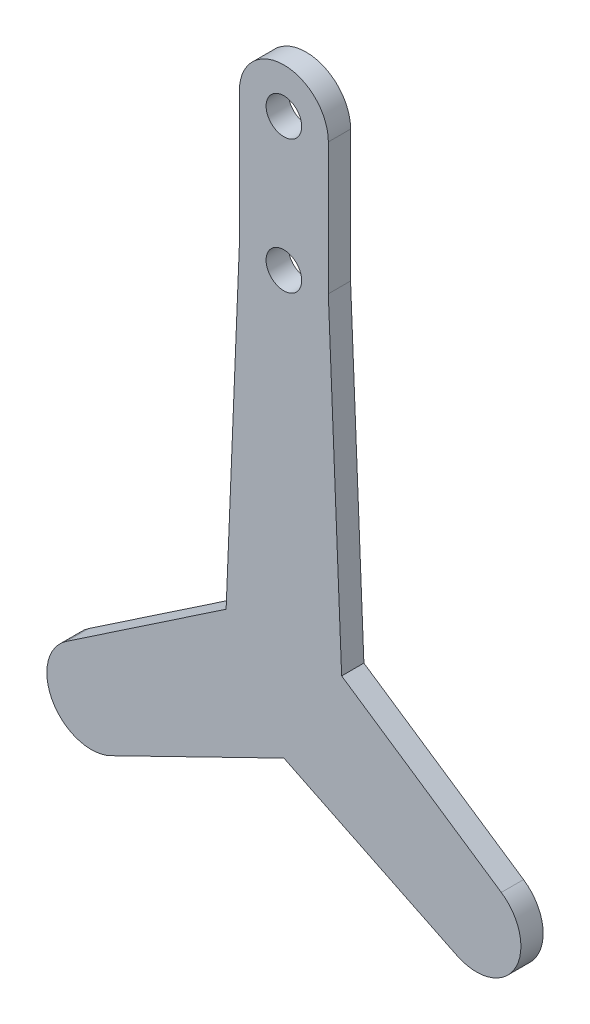
ISO-10303-21;
HEADER;
FILE_DESCRIPTION(('STEP AP214'),'2;1');
FILE_NAME('part.step','',(''),(''),'','','');
FILE_SCHEMA(('AUTOMOTIVE_DESIGN { 1 0 10303 214 1 1 1 1 }'));
ENDSEC;
DATA;
#1=APPLICATION_CONTEXT('core data for automotive mechanical design processes');
#2=APPLICATION_PROTOCOL_DEFINITION('international standard','automotive_design',2000,#1);
#3=PRODUCT_CONTEXT('',#1,'mechanical');
#4=PRODUCT('Part','Part','',(#3));
#5=PRODUCT_RELATED_PRODUCT_CATEGORY('part','',(#4));
#6=PRODUCT_DEFINITION_FORMATION('','',#4);
#7=PRODUCT_DEFINITION_CONTEXT('part definition',#1,'design');
#8=PRODUCT_DEFINITION('design','',#6,#7);
#9=PRODUCT_DEFINITION_SHAPE('','',#8);
#10=(LENGTH_UNIT() NAMED_UNIT(*) SI_UNIT(.MILLI.,.METRE.));
#11=(NAMED_UNIT(*) PLANE_ANGLE_UNIT() SI_UNIT($,.RADIAN.));
#12=(NAMED_UNIT(*) SI_UNIT($,.STERADIAN.) SOLID_ANGLE_UNIT());
#13=UNCERTAINTY_MEASURE_WITH_UNIT(LENGTH_MEASURE(1.E-05),#10,'distance_accuracy_value','');
#14=(GEOMETRIC_REPRESENTATION_CONTEXT(3) GLOBAL_UNCERTAINTY_ASSIGNED_CONTEXT((#13)) GLOBAL_UNIT_ASSIGNED_CONTEXT((#10,
#11,#12)) REPRESENTATION_CONTEXT('',''));
#15=CARTESIAN_POINT('',(0.,0.,0.));
#16=DIRECTION('',(0.,0.,1.));
#17=DIRECTION('',(1.,0.,0.));
#18=AXIS2_PLACEMENT_3D('',#15,#16,#17);
#19=CARTESIAN_POINT('',(48.8920670997291,-96.7088607594935,5.));
#20=DIRECTION('',(-0.559079691050712,-0.829113924050634,0.));
#21=DIRECTION('',(0.829113924050634,-0.559079691050712,0.));
#22=AXIS2_PLACEMENT_3D('',#19,#20,#21);
#23=PLANE('',#22);
#24=DIRECTION('',(-0.829113924050634,0.559079691050712,0.));
#25=VECTOR('',#24,1.);
#26=CARTESIAN_POINT('',(48.8920670997291,-96.7088607594935,0.));
#27=LINE('',#26,#25);
#28=CARTESIAN_POINT('',(48.8920670997291,-96.7088607594935,0.));
#29=VERTEX_POINT('',#28);
#30=CARTESIAN_POINT('',(12.9903810567665,-72.4999999999999,0.));
#31=VERTEX_POINT('',#30);
#32=EDGE_CURVE('E156',#29,#31,#27,.T.);
#33=ORIENTED_EDGE('',*,*,#32,.T.);
#34=DIRECTION('',(0.,0.,-1.));
#35=VECTOR('',#34,1.);
#36=CARTESIAN_POINT('',(12.9903810567665,-72.4999999999999,5.));
#37=LINE('',#36,#35);
#38=CARTESIAN_POINT('',(12.9903810567665,-72.4999999999999,5.));
#39=VERTEX_POINT('',#38);
#40=EDGE_CURVE('E11',#39,#31,#37,.T.);
#41=ORIENTED_EDGE('',*,*,#40,.F.);
#42=DIRECTION('',(-0.829113924050634,0.559079691050712,0.));
#43=VECTOR('',#42,1.);
#44=CARTESIAN_POINT('',(48.8920670997291,-96.7088607594935,5.));
#45=LINE('',#44,#43);
#46=CARTESIAN_POINT('',(48.8920670997291,-96.7088607594935,5.));
#47=VERTEX_POINT('',#46);
#48=EDGE_CURVE('E184',#47,#39,#45,.T.);
#49=ORIENTED_EDGE('',*,*,#48,.F.);
#50=DIRECTION('',(0.,0.,-1.));
#51=VECTOR('',#50,1.);
#52=CARTESIAN_POINT('',(48.8920670997291,-96.7088607594935,5.));
#53=LINE('',#52,#51);
#54=EDGE_CURVE('E57',#47,#29,#53,.T.);
#55=ORIENTED_EDGE('',*,*,#54,.T.);
#56=EDGE_LOOP('',(#33,#41,#49,#55));
#57=FACE_BOUND('',#56,.T.);
#58=ADVANCED_FACE('F41',(#57),#23,.F.);
#59=CARTESIAN_POINT('',(12.9903810567665,-72.4999999999999,5.));
#60=DIRECTION('',(-0.999155232502027,-0.0410952717939794,0.));
#61=DIRECTION('',(0.0410952717939794,-0.999155232502027,0.));
#62=AXIS2_PLACEMENT_3D('',#59,#60,#61);
#63=PLANE('',#62);
#64=DIRECTION('',(-0.0410952717939794,0.999155232502027,0.));
#65=VECTOR('',#64,1.);
#66=CARTESIAN_POINT('',(12.9903810567665,-72.4999999999999,0.));
#67=LINE('',#66,#65);
#68=CARTESIAN_POINT('',(9.99155232502026,0.410952717939794,0.));
#69=VERTEX_POINT('',#68);
#70=EDGE_CURVE('E158',#31,#69,#67,.T.);
#71=ORIENTED_EDGE('',*,*,#70,.T.);
#72=DIRECTION('',(0.,0.,-1.));
#73=VECTOR('',#72,1.);
#74=CARTESIAN_POINT('',(9.99155232502026,0.410952717939794,5.));
#75=LINE('',#74,#73);
#76=CARTESIAN_POINT('',(9.99155232502026,0.410952717939794,5.));
#77=VERTEX_POINT('',#76);
#78=EDGE_CURVE('E49',#77,#69,#75,.T.);
#79=ORIENTED_EDGE('',*,*,#78,.F.);
#80=DIRECTION('',(-0.0410952717939794,0.999155232502027,0.));
#81=VECTOR('',#80,1.);
#82=CARTESIAN_POINT('',(12.9903810567665,-72.4999999999999,5.));
#83=LINE('',#82,#81);
#84=EDGE_CURVE('E105',#39,#77,#83,.T.);
#85=ORIENTED_EDGE('',*,*,#84,.F.);
#86=ORIENTED_EDGE('',*,*,#40,.T.);
#87=EDGE_LOOP('',(#71,#79,#85,#86));
#88=FACE_BOUND('',#87,.T.);
#89=ADVANCED_FACE('F204',(#88),#63,.F.);
#90=CARTESIAN_POINT('',(10.,30.,5.));
#91=DIRECTION('',(0.999999959244858,-0.000285500055305071,0.));
#92=DIRECTION('',(0.000285500055305071,0.999999959244858,0.));
#93=AXIS2_PLACEMENT_3D('',#90,#91,#92);
#94=PLANE('',#93);
#95=DIRECTION('',(-0.000285500055305071,-0.999999959244858,0.));
#96=VECTOR('',#95,1.);
#97=CARTESIAN_POINT('',(10.,30.,0.));
#98=LINE('',#97,#96);
#99=CARTESIAN_POINT('',(10.,30.,0.));
#100=VERTEX_POINT('',#99);
#101=EDGE_CURVE('E162',#100,#69,#98,.T.);
#102=ORIENTED_EDGE('',*,*,#101,.F.);
#103=DIRECTION('',(0.,0.,-1.));
#104=VECTOR('',#103,1.);
#105=CARTESIAN_POINT('',(10.,30.,5.));
#106=LINE('',#105,#104);
#107=CARTESIAN_POINT('',(10.,30.,5.));
#108=VERTEX_POINT('',#107);
#109=EDGE_CURVE('E197',#108,#100,#106,.T.);
#110=ORIENTED_EDGE('',*,*,#109,.F.);
#111=DIRECTION('',(-0.000285500055305071,-0.999999959244858,0.));
#112=VECTOR('',#111,1.);
#113=CARTESIAN_POINT('',(10.,30.,5.));
#114=LINE('',#113,#112);
#115=EDGE_CURVE('E203',#108,#77,#114,.T.);
#116=ORIENTED_EDGE('',*,*,#115,.T.);
#117=ORIENTED_EDGE('',*,*,#78,.T.);
#118=EDGE_LOOP('',(#102,#110,#116,#117));
#119=FACE_BOUND('',#118,.T.);
#120=ADVANCED_FACE('F201',(#119),#94,.T.);
#121=CARTESIAN_POINT('',(0.,30.,5.));
#122=DIRECTION('',(0.,0.,-1.));
#123=DIRECTION('',(-1.,0.,0.));
#124=AXIS2_PLACEMENT_3D('',#121,#122,#123);
#125=CYLINDRICAL_SURFACE('',#124,10.);
#126=CARTESIAN_POINT('',(0.,30.,0.));
#127=DIRECTION('',(0.,0.,-1.));
#128=DIRECTION('',(-1.,0.,0.));
#129=AXIS2_PLACEMENT_3D('',#126,#127,#128);
#130=CIRCLE('',#129,10.);
#131=CARTESIAN_POINT('',(-10.,30.,0.));
#132=VERTEX_POINT('',#131);
#133=EDGE_CURVE('E165',#132,#100,#130,.T.);
#134=ORIENTED_EDGE('',*,*,#133,.F.);
#135=DIRECTION('',(0.,0.,-1.));
#136=VECTOR('',#135,1.);
#137=CARTESIAN_POINT('',(-10.,30.,5.));
#138=LINE('',#137,#136);
#139=CARTESIAN_POINT('',(-10.,30.,5.));
#140=VERTEX_POINT('',#139);
#141=EDGE_CURVE('E195',#140,#132,#138,.T.);
#142=ORIENTED_EDGE('',*,*,#141,.F.);
#143=CARTESIAN_POINT('',(0.,30.,5.));
#144=DIRECTION('',(0.,0.,-1.));
#145=DIRECTION('',(-1.,0.,0.));
#146=AXIS2_PLACEMENT_3D('',#143,#144,#145);
#147=CIRCLE('',#146,10.);
#148=EDGE_CURVE('E215',#140,#108,#147,.T.);
#149=ORIENTED_EDGE('',*,*,#148,.T.);
#150=ORIENTED_EDGE('',*,*,#109,.T.);
#151=EDGE_LOOP('',(#134,#142,#149,#150));
#152=FACE_BOUND('',#151,.T.);
#153=ADVANCED_FACE('F211',(#152),#125,.T.);
#154=CARTESIAN_POINT('',(-10.,30.,5.));
#155=DIRECTION('',(0.999999959244858,0.000285500055305071,0.));
#156=DIRECTION('',(-0.000285500055305071,0.999999959244858,0.));
#157=AXIS2_PLACEMENT_3D('',#154,#155,#156);
#158=PLANE('',#157);
#159=DIRECTION('',(0.000285500055305071,-0.999999959244858,0.));
#160=VECTOR('',#159,1.);
#161=CARTESIAN_POINT('',(-10.,30.,0.));
#162=LINE('',#161,#160);
#163=CARTESIAN_POINT('',(-9.99155232502026,0.410952717939792,0.));
#164=VERTEX_POINT('',#163);
#165=EDGE_CURVE('E168',#132,#164,#162,.T.);
#166=ORIENTED_EDGE('',*,*,#165,.T.);
#167=DIRECTION('',(0.,0.,-1.));
#168=VECTOR('',#167,1.);
#169=CARTESIAN_POINT('',(-9.99155232502026,0.410952717939792,5.));
#170=LINE('',#169,#168);
#171=CARTESIAN_POINT('',(-9.99155232502026,0.410952717939792,5.));
#172=VERTEX_POINT('',#171);
#173=EDGE_CURVE('E193',#172,#164,#170,.T.);
#174=ORIENTED_EDGE('',*,*,#173,.F.);
#175=DIRECTION('',(0.000285500055305071,-0.999999959244858,0.));
#176=VECTOR('',#175,1.);
#177=CARTESIAN_POINT('',(-10.,30.,5.));
#178=LINE('',#177,#176);
#179=EDGE_CURVE('E217',#140,#172,#178,.T.);
#180=ORIENTED_EDGE('',*,*,#179,.F.);
#181=ORIENTED_EDGE('',*,*,#141,.T.);
#182=EDGE_LOOP('',(#166,#174,#180,#181));
#183=FACE_BOUND('',#182,.T.);
#184=ADVANCED_FACE('F359',(#183),#158,.F.);
#185=CARTESIAN_POINT('',(-12.9903810567665,-72.4999999999999,5.));
#186=DIRECTION('',(-0.999155232502027,0.0410952717939792,0.));
#187=DIRECTION('',(-0.0410952717939792,-0.999155232502027,0.));
#188=AXIS2_PLACEMENT_3D('',#185,#186,#187);
#189=PLANE('',#188);
#190=DIRECTION('',(0.0410952717939792,0.999155232502027,0.));
#191=VECTOR('',#190,1.);
#192=CARTESIAN_POINT('',(-12.9903810567665,-72.4999999999999,0.));
#193=LINE('',#192,#191);
#194=CARTESIAN_POINT('',(-12.9903810567665,-72.4999999999999,0.));
#195=VERTEX_POINT('',#194);
#196=EDGE_CURVE('E171',#195,#164,#193,.T.);
#197=ORIENTED_EDGE('',*,*,#196,.F.);
#198=DIRECTION('',(0.,0.,-1.));
#199=VECTOR('',#198,1.);
#200=CARTESIAN_POINT('',(-12.9903810567665,-72.4999999999999,5.));
#201=LINE('',#200,#199);
#202=CARTESIAN_POINT('',(-12.9903810567665,-72.4999999999999,5.));
#203=VERTEX_POINT('',#202);
#204=EDGE_CURVE('E191',#203,#195,#201,.T.);
#205=ORIENTED_EDGE('',*,*,#204,.F.);
#206=DIRECTION('',(0.0410952717939792,0.999155232502027,0.));
#207=VECTOR('',#206,1.);
#208=CARTESIAN_POINT('',(-12.9903810567665,-72.4999999999999,5.));
#209=LINE('',#208,#207);
#210=EDGE_CURVE('E223',#203,#172,#209,.T.);
#211=ORIENTED_EDGE('',*,*,#210,.T.);
#212=ORIENTED_EDGE('',*,*,#173,.T.);
#213=EDGE_LOOP('',(#197,#205,#211,#212));
#214=FACE_BOUND('',#213,.T.);
#215=ADVANCED_FACE('F349',(#214),#189,.T.);
#216=CARTESIAN_POINT('',(-12.9903810567665,-72.4999999999999,5.));
#217=DIRECTION('',(0.559079691050712,-0.829113924050634,0.));
#218=DIRECTION('',(0.829113924050634,0.559079691050712,0.));
#219=AXIS2_PLACEMENT_3D('',#216,#217,#218);
#220=PLANE('',#219);
#221=DIRECTION('',(-0.829113924050634,-0.559079691050712,0.));
#222=VECTOR('',#221,1.);
#223=CARTESIAN_POINT('',(-12.9903810567665,-72.4999999999999,0.));
#224=LINE('',#223,#222);
#225=CARTESIAN_POINT('',(-48.8920670997291,-96.7088607594935,0.));
#226=VERTEX_POINT('',#225);
#227=EDGE_CURVE('E174',#195,#226,#224,.T.);
#228=ORIENTED_EDGE('',*,*,#227,.T.);
#229=DIRECTION('',(0.,0.,-1.));
#230=VECTOR('',#229,1.);
#231=CARTESIAN_POINT('',(-48.8920670997291,-96.7088607594935,5.));
#232=LINE('',#231,#230);
#233=CARTESIAN_POINT('',(-48.8920670997291,-96.7088607594935,5.));
#234=VERTEX_POINT('',#233);
#235=EDGE_CURVE('E188',#234,#226,#232,.T.);
#236=ORIENTED_EDGE('',*,*,#235,.F.);
#237=DIRECTION('',(-0.829113924050634,-0.559079691050712,0.));
#238=VECTOR('',#237,1.);
#239=CARTESIAN_POINT('',(-12.9903810567665,-72.4999999999999,5.));
#240=LINE('',#239,#238);
#241=EDGE_CURVE('E226',#203,#234,#240,.T.);
#242=ORIENTED_EDGE('',*,*,#241,.F.);
#243=ORIENTED_EDGE('',*,*,#204,.T.);
#244=EDGE_LOOP('',(#228,#236,#242,#243));
#245=FACE_BOUND('',#244,.T.);
#246=ADVANCED_FACE('F231',(#245),#220,.F.);
#247=CARTESIAN_POINT('',(-43.301270189222,-105.,5.));
#248=DIRECTION('',(0.,0.,-1.));
#249=DIRECTION('',(-1.,0.,0.));
#250=AXIS2_PLACEMENT_3D('',#247,#248,#249);
#251=CYLINDRICAL_SURFACE('',#250,10.);
#252=CARTESIAN_POINT('',(-43.301270189222,-105.,0.));
#253=DIRECTION('',(0.,0.,1.));
#254=DIRECTION('',(1.,0.,0.));
#255=AXIS2_PLACEMENT_3D('',#252,#253,#254);
#256=CIRCLE('',#255,10.);
#257=CARTESIAN_POINT('',(-38.9163314358831,-113.987341772152,0.));
#258=VERTEX_POINT('',#257);
#259=EDGE_CURVE('E176',#226,#258,#256,.T.);
#260=ORIENTED_EDGE('',*,*,#259,.T.);
#261=DIRECTION('',(0.,0.,-1.));
#262=VECTOR('',#261,1.);
#263=CARTESIAN_POINT('',(-38.9163314358831,-113.987341772152,5.));
#264=LINE('',#263,#262);
#265=CARTESIAN_POINT('',(-38.9163314358831,-113.987341772152,5.));
#266=VERTEX_POINT('',#265);
#267=EDGE_CURVE('E148',#266,#258,#264,.T.);
#268=ORIENTED_EDGE('',*,*,#267,.F.);
#269=CARTESIAN_POINT('',(-43.301270189222,-105.,5.));
#270=DIRECTION('',(0.,0.,1.));
#271=DIRECTION('',(1.,0.,0.));
#272=AXIS2_PLACEMENT_3D('',#269,#270,#271);
#273=CIRCLE('',#272,10.);
#274=EDGE_CURVE('E136',#234,#266,#273,.T.);
#275=ORIENTED_EDGE('',*,*,#274,.F.);
#276=ORIENTED_EDGE('',*,*,#235,.T.);
#277=EDGE_LOOP('',(#260,#268,#275,#276));
#278=FACE_BOUND('',#277,.T.);
#279=ADVANCED_FACE('F235',(#278),#251,.T.);
#280=CARTESIAN_POINT('',(-38.9163314358831,-113.987341772152,5.));
#281=DIRECTION('',(-0.438493875333891,0.898734177215191,0.));
#282=DIRECTION('',(-0.898734177215191,-0.438493875333891,0.));
#283=AXIS2_PLACEMENT_3D('',#280,#281,#282);
#284=PLANE('',#283);
#285=DIRECTION('',(0.898734177215191,0.438493875333891,0.));
#286=VECTOR('',#285,1.);
#287=CARTESIAN_POINT('',(-38.9163314358831,-113.987341772152,0.));
#288=LINE('',#287,#286);
#289=CARTESIAN_POINT('',(0.,-95.,0.));
#290=VERTEX_POINT('',#289);
#291=EDGE_CURVE('E145',#258,#290,#288,.T.);
#292=ORIENTED_EDGE('',*,*,#291,.T.);
#293=DIRECTION('',(0.,0.,-1.));
#294=VECTOR('',#293,1.);
#295=CARTESIAN_POINT('',(0.,-95.,5.));
#296=LINE('',#295,#294);
#297=CARTESIAN_POINT('',(0.,-95.,5.));
#298=VERTEX_POINT('',#297);
#299=EDGE_CURVE('E142',#298,#290,#296,.T.);
#300=ORIENTED_EDGE('',*,*,#299,.F.);
#301=DIRECTION('',(0.898734177215191,0.438493875333891,0.));
#302=VECTOR('',#301,1.);
#303=CARTESIAN_POINT('',(-38.9163314358831,-113.987341772152,5.));
#304=LINE('',#303,#302);
#305=EDGE_CURVE('E129',#266,#298,#304,.T.);
#306=ORIENTED_EDGE('',*,*,#305,.F.);
#307=ORIENTED_EDGE('',*,*,#267,.T.);
#308=EDGE_LOOP('',(#292,#300,#306,#307));
#309=FACE_BOUND('',#308,.T.);
#310=ADVANCED_FACE('F143',(#309),#284,.F.);
#311=CARTESIAN_POINT('',(0.,-95.,5.));
#312=DIRECTION('',(0.43849387533389,0.898734177215191,0.));
#313=DIRECTION('',(-0.898734177215191,0.43849387533389,0.));
#314=AXIS2_PLACEMENT_3D('',#311,#312,#313);
#315=PLANE('',#314);
#316=DIRECTION('',(0.898734177215191,-0.43849387533389,0.));
#317=VECTOR('',#316,1.);
#318=CARTESIAN_POINT('',(0.,-95.,0.));
#319=LINE('',#318,#317);
#320=CARTESIAN_POINT('',(38.9163314358831,-113.987341772152,0.));
#321=VERTEX_POINT('',#320);
#322=EDGE_CURVE('E179',#290,#321,#319,.T.);
#323=ORIENTED_EDGE('',*,*,#322,.T.);
#324=DIRECTION('',(0.,0.,-1.));
#325=VECTOR('',#324,1.);
#326=CARTESIAN_POINT('',(38.9163314358831,-113.987341772152,5.));
#327=LINE('',#326,#325);
#328=CARTESIAN_POINT('',(38.9163314358831,-113.987341772152,5.));
#329=VERTEX_POINT('',#328);
#330=EDGE_CURVE('E93',#329,#321,#327,.T.);
#331=ORIENTED_EDGE('',*,*,#330,.F.);
#332=DIRECTION('',(0.898734177215191,-0.43849387533389,0.));
#333=VECTOR('',#332,1.);
#334=CARTESIAN_POINT('',(0.,-95.,5.));
#335=LINE('',#334,#333);
#336=EDGE_CURVE('E134',#298,#329,#335,.T.);
#337=ORIENTED_EDGE('',*,*,#336,.F.);
#338=ORIENTED_EDGE('',*,*,#299,.T.);
#339=EDGE_LOOP('',(#323,#331,#337,#338));
#340=FACE_BOUND('',#339,.T.);
#341=ADVANCED_FACE('F150',(#340),#315,.F.);
#342=CARTESIAN_POINT('',(43.301270189222,-105.,5.));
#343=DIRECTION('',(0.,0.,-1.));
#344=DIRECTION('',(-1.,0.,0.));
#345=AXIS2_PLACEMENT_3D('',#342,#343,#344);
#346=CYLINDRICAL_SURFACE('',#345,10.);
#347=CARTESIAN_POINT('',(43.301270189222,-105.,0.));
#348=DIRECTION('',(0.,0.,-1.));
#349=DIRECTION('',(-1.,0.,0.));
#350=AXIS2_PLACEMENT_3D('',#347,#348,#349);
#351=CIRCLE('',#350,10.);
#352=EDGE_CURVE('E181',#29,#321,#351,.T.);
#353=ORIENTED_EDGE('',*,*,#352,.F.);
#354=ORIENTED_EDGE('',*,*,#54,.F.);
#355=CARTESIAN_POINT('',(43.301270189222,-105.,5.));
#356=DIRECTION('',(0.,0.,-1.));
#357=DIRECTION('',(-1.,0.,0.));
#358=AXIS2_PLACEMENT_3D('',#355,#356,#357);
#359=CIRCLE('',#358,10.);
#360=EDGE_CURVE('E151',#47,#329,#359,.T.);
#361=ORIENTED_EDGE('',*,*,#360,.T.);
#362=ORIENTED_EDGE('',*,*,#330,.T.);
#363=EDGE_LOOP('',(#353,#354,#361,#362));
#364=FACE_BOUND('',#363,.T.);
#365=ADVANCED_FACE('F236',(#364),#346,.T.);
#366=CARTESIAN_POINT('',(0.,30.,5.));
#367=DIRECTION('',(0.,0.,-1.));
#368=DIRECTION('',(-1.,0.,0.));
#369=AXIS2_PLACEMENT_3D('',#366,#367,#368);
#370=PLANE('',#369);
#371=CARTESIAN_POINT('',(0.,30.,5.));
#372=DIRECTION('',(0.,0.,-1.));
#373=DIRECTION('',(-1.,0.,0.));
#374=AXIS2_PLACEMENT_3D('',#371,#372,#373);
#375=CIRCLE('',#374,4.);
#376=CARTESIAN_POINT('',(-4.,30.,5.));
#377=VERTEX_POINT('',#376);
#378=EDGE_CURVE('E159',#377,#377,#375,.T.);
#379=ORIENTED_EDGE('',*,*,#378,.T.);
#380=EDGE_LOOP('',(#379));
#381=FACE_BOUND('',#380,.T.);
#382=CARTESIAN_POINT('',(0.,0.,5.));
#383=DIRECTION('',(0.,0.,-1.));
#384=DIRECTION('',(-1.,0.,0.));
#385=AXIS2_PLACEMENT_3D('',#382,#383,#384);
#386=CIRCLE('',#385,4.);
#387=CARTESIAN_POINT('',(-4.,0.,5.));
#388=VERTEX_POINT('',#387);
#389=EDGE_CURVE('E252',#388,#388,#386,.T.);
#390=ORIENTED_EDGE('',*,*,#389,.T.);
#391=EDGE_LOOP('',(#390));
#392=FACE_BOUND('',#391,.T.);
#393=ORIENTED_EDGE('',*,*,#48,.T.);
#394=ORIENTED_EDGE('',*,*,#84,.T.);
#395=ORIENTED_EDGE('',*,*,#115,.F.);
#396=ORIENTED_EDGE('',*,*,#148,.F.);
#397=ORIENTED_EDGE('',*,*,#179,.T.);
#398=ORIENTED_EDGE('',*,*,#210,.F.);
#399=ORIENTED_EDGE('',*,*,#241,.T.);
#400=ORIENTED_EDGE('',*,*,#274,.T.);
#401=ORIENTED_EDGE('',*,*,#305,.T.);
#402=ORIENTED_EDGE('',*,*,#336,.T.);
#403=ORIENTED_EDGE('',*,*,#360,.F.);
#404=EDGE_LOOP('',(#393,#394,#395,#396,#397,#398,#399,#400,#401,#402,#403));
#405=FACE_BOUND('',#404,.T.);
#406=ADVANCED_FACE('F131',(#381,#392,#405),#370,.F.);
#407=CARTESIAN_POINT('',(0.,30.,0.));
#408=DIRECTION('',(0.,0.,-1.));
#409=DIRECTION('',(-1.,0.,0.));
#410=AXIS2_PLACEMENT_3D('',#407,#408,#409);
#411=PLANE('',#410);
#412=CARTESIAN_POINT('',(0.,30.,0.));
#413=DIRECTION('',(0.,0.,-1.));
#414=DIRECTION('',(-1.,0.,0.));
#415=AXIS2_PLACEMENT_3D('',#412,#413,#414);
#416=CIRCLE('',#415,4.);
#417=CARTESIAN_POINT('',(-4.,30.,0.));
#418=VERTEX_POINT('',#417);
#419=EDGE_CURVE('E258',#418,#418,#416,.T.);
#420=ORIENTED_EDGE('',*,*,#419,.F.);
#421=EDGE_LOOP('',(#420));
#422=FACE_BOUND('',#421,.T.);
#423=CARTESIAN_POINT('',(0.,0.,0.));
#424=DIRECTION('',(0.,0.,-1.));
#425=DIRECTION('',(-1.,0.,0.));
#426=AXIS2_PLACEMENT_3D('',#423,#424,#425);
#427=CIRCLE('',#426,4.);
#428=CARTESIAN_POINT('',(-4.,0.,0.));
#429=VERTEX_POINT('',#428);
#430=EDGE_CURVE('E255',#429,#429,#427,.T.);
#431=ORIENTED_EDGE('',*,*,#430,.F.);
#432=EDGE_LOOP('',(#431));
#433=FACE_BOUND('',#432,.T.);
#434=ORIENTED_EDGE('',*,*,#32,.F.);
#435=ORIENTED_EDGE('',*,*,#352,.T.);
#436=ORIENTED_EDGE('',*,*,#322,.F.);
#437=ORIENTED_EDGE('',*,*,#291,.F.);
#438=ORIENTED_EDGE('',*,*,#259,.F.);
#439=ORIENTED_EDGE('',*,*,#227,.F.);
#440=ORIENTED_EDGE('',*,*,#196,.T.);
#441=ORIENTED_EDGE('',*,*,#165,.F.);
#442=ORIENTED_EDGE('',*,*,#133,.T.);
#443=ORIENTED_EDGE('',*,*,#101,.T.);
#444=ORIENTED_EDGE('',*,*,#70,.F.);
#445=EDGE_LOOP('',(#434,#435,#436,#437,#438,#439,#440,#441,#442,#443,#444));
#446=FACE_BOUND('',#445,.T.);
#447=ADVANCED_FACE('F207',(#422,#433,#446),#411,.T.);
#448=CARTESIAN_POINT('',(0.,0.,5.));
#449=DIRECTION('',(0.,0.,-1.));
#450=DIRECTION('',(-1.,0.,0.));
#451=AXIS2_PLACEMENT_3D('',#448,#449,#450);
#452=CYLINDRICAL_SURFACE('',#451,4.);
#453=ORIENTED_EDGE('',*,*,#389,.F.);
#454=EDGE_LOOP('',(#453));
#455=FACE_BOUND('',#454,.T.);
#456=ORIENTED_EDGE('',*,*,#430,.T.);
#457=EDGE_LOOP('',(#456));
#458=FACE_BOUND('',#457,.T.);
#459=ADVANCED_FACE('F268',(#455,#458),#452,.F.);
#460=CARTESIAN_POINT('',(0.,30.,5.));
#461=DIRECTION('',(0.,0.,-1.));
#462=DIRECTION('',(-1.,0.,0.));
#463=AXIS2_PLACEMENT_3D('',#460,#461,#462);
#464=CYLINDRICAL_SURFACE('',#463,4.);
#465=ORIENTED_EDGE('',*,*,#378,.F.);
#466=EDGE_LOOP('',(#465));
#467=FACE_BOUND('',#466,.T.);
#468=ORIENTED_EDGE('',*,*,#419,.T.);
#469=EDGE_LOOP('',(#468));
#470=FACE_BOUND('',#469,.T.);
#471=ADVANCED_FACE('F265',(#467,#470),#464,.F.);
#472=CLOSED_SHELL('',(#58,#89,#120,#153,#184,#215,#246,#279,#310,#341,#365,#406,#447,#459,#471));
#473=MANIFOLD_SOLID_BREP('B2',#472);
#474=ADVANCED_BREP_SHAPE_REPRESENTATION('',(#18,#473),#14);
#475=SHAPE_DEFINITION_REPRESENTATION(#9,#474);
ENDSEC;
END-ISO-10303-21;
